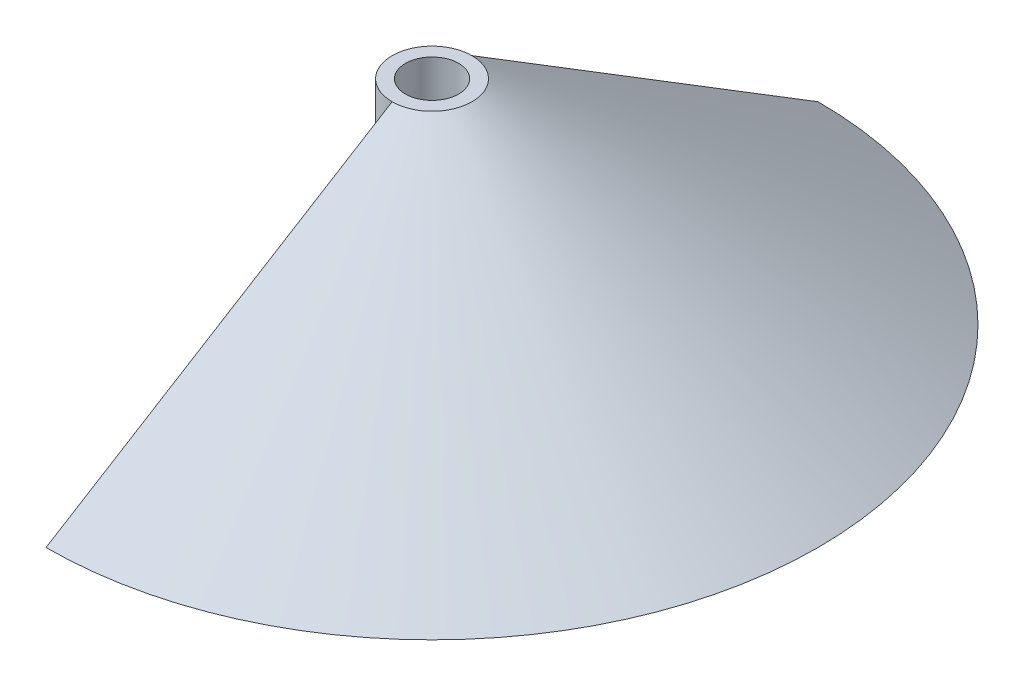
ISO-10303-21;
HEADER;
FILE_DESCRIPTION(('STEP AP214'),'2;1');
FILE_NAME('part.step','',(''),(''),'','','');
FILE_SCHEMA(('AUTOMOTIVE_DESIGN { 1 0 10303 214 1 1 1 1 }'));
ENDSEC;
DATA;
#1=APPLICATION_CONTEXT('core data for automotive mechanical design processes');
#2=APPLICATION_PROTOCOL_DEFINITION('international standard','automotive_design',2000,#1);
#3=PRODUCT_CONTEXT('',#1,'mechanical');
#4=PRODUCT('Part','Part','',(#3));
#5=PRODUCT_RELATED_PRODUCT_CATEGORY('part','',(#4));
#6=PRODUCT_DEFINITION_FORMATION('','',#4);
#7=PRODUCT_DEFINITION_CONTEXT('part definition',#1,'design');
#8=PRODUCT_DEFINITION('design','',#6,#7);
#9=PRODUCT_DEFINITION_SHAPE('','',#8);
#10=(LENGTH_UNIT() NAMED_UNIT(*) SI_UNIT(.MILLI.,.METRE.));
#11=(NAMED_UNIT(*) PLANE_ANGLE_UNIT() SI_UNIT($,.RADIAN.));
#12=(NAMED_UNIT(*) SI_UNIT($,.STERADIAN.) SOLID_ANGLE_UNIT());
#13=UNCERTAINTY_MEASURE_WITH_UNIT(LENGTH_MEASURE(1.E-05),#10,'distance_accuracy_value','');
#14=(GEOMETRIC_REPRESENTATION_CONTEXT(3) GLOBAL_UNCERTAINTY_ASSIGNED_CONTEXT((#13)) GLOBAL_UNIT_ASSIGNED_CONTEXT((#10,
#11,#12)) REPRESENTATION_CONTEXT('',''));
#15=CARTESIAN_POINT('',(0.,0.,0.));
#16=DIRECTION('',(0.,0.,1.));
#17=DIRECTION('',(1.,0.,0.));
#18=AXIS2_PLACEMENT_3D('',#15,#16,#17);
#19=CARTESIAN_POINT('',(0.,8.,0.));
#20=DIRECTION('',(0.,1.,0.));
#21=DIRECTION('',(0.,0.,1.));
#22=AXIS2_PLACEMENT_3D('',#19,#20,#21);
#23=PLANE('',#22);
#24=CARTESIAN_POINT('',(0.,8.,0.));
#25=DIRECTION('',(0.,1.,0.));
#26=DIRECTION('',(0.,0.,1.));
#27=AXIS2_PLACEMENT_3D('',#24,#25,#26);
#28=CIRCLE('',#27,2.);
#29=CARTESIAN_POINT('',(0.,8.,2.));
#30=VERTEX_POINT('',#29);
#31=EDGE_CURVE('E99',#30,#30,#28,.T.);
#32=ORIENTED_EDGE('',*,*,#31,.F.);
#33=EDGE_LOOP('',(#32));
#34=FACE_BOUND('',#33,.T.);
#35=CARTESIAN_POINT('',(0.,8.,0.));
#36=DIRECTION('',(0.,-1.,0.));
#37=DIRECTION('',(0.,0.,-1.));
#38=AXIS2_PLACEMENT_3D('',#35,#36,#37);
#39=CIRCLE('',#38,3.);
#40=CARTESIAN_POINT('',(0.,8.,-3.));
#41=VERTEX_POINT('',#40);
#42=CARTESIAN_POINT('',(0.,8.,3.));
#43=VERTEX_POINT('',#42);
#44=EDGE_CURVE('E105',#41,#43,#39,.T.);
#45=ORIENTED_EDGE('',*,*,#44,.F.);
#46=CARTESIAN_POINT('',(0.,8.,0.));
#47=DIRECTION('',(0.,-1.,0.));
#48=DIRECTION('',(0.,0.,1.));
#49=AXIS2_PLACEMENT_3D('',#46,#47,#48);
#50=CIRCLE('',#49,3.);
#51=EDGE_CURVE('E81',#43,#41,#50,.T.);
#52=ORIENTED_EDGE('',*,*,#51,.F.);
#53=EDGE_LOOP('',(#45,#52));
#54=FACE_BOUND('',#53,.T.);
#55=ADVANCED_FACE('F43',(#34,#54),#23,.T.);
#56=CARTESIAN_POINT('',(0.,-8.,-29.));
#57=DIRECTION('',(0.,-1.,0.));
#58=DIRECTION('',(0.,0.,-1.));
#59=AXIS2_PLACEMENT_3D('',#56,#57,#58);
#60=PLANE('',#59);
#61=CARTESIAN_POINT('',(0.,-8.00000000000001,0.));
#62=DIRECTION('',(0.,1.,0.));
#63=DIRECTION('',(0.,0.,1.));
#64=AXIS2_PLACEMENT_3D('',#61,#62,#63);
#65=CIRCLE('',#64,2.);
#66=CARTESIAN_POINT('',(0.,-8.00000000000001,2.));
#67=VERTEX_POINT('',#66);
#68=EDGE_CURVE('E96',#67,#67,#65,.T.);
#69=ORIENTED_EDGE('',*,*,#68,.T.);
#70=EDGE_LOOP('',(#69));
#71=FACE_BOUND('',#70,.T.);
#72=DIRECTION('',(0.,0.,-1.));
#73=VECTOR('',#72,1.);
#74=CARTESIAN_POINT('',(0.,-8.,3.));
#75=LINE('',#74,#73);
#76=CARTESIAN_POINT('',(0.,-8.,29.));
#77=VERTEX_POINT('',#76);
#78=CARTESIAN_POINT('',(0.,-8.,3.));
#79=VERTEX_POINT('',#78);
#80=EDGE_CURVE('E83',#77,#79,#75,.T.);
#81=ORIENTED_EDGE('',*,*,#80,.T.);
#82=CARTESIAN_POINT('',(0.,-8.,0.));
#83=DIRECTION('',(0.,-1.,0.));
#84=DIRECTION('',(0.,0.,1.));
#85=AXIS2_PLACEMENT_3D('',#82,#83,#84);
#86=CIRCLE('',#85,3.);
#87=CARTESIAN_POINT('',(0.,-8.,-3.));
#88=VERTEX_POINT('',#87);
#89=EDGE_CURVE('E78',#79,#88,#86,.T.);
#90=ORIENTED_EDGE('',*,*,#89,.T.);
#91=DIRECTION('',(0.,0.,-1.));
#92=VECTOR('',#91,1.);
#93=CARTESIAN_POINT('',(0.,-8.,-3.));
#94=LINE('',#93,#92);
#95=CARTESIAN_POINT('',(0.,-8.,-29.));
#96=VERTEX_POINT('',#95);
#97=EDGE_CURVE('E85',#88,#96,#94,.T.);
#98=ORIENTED_EDGE('',*,*,#97,.T.);
#99=CARTESIAN_POINT('',(0.,-8.,0.));
#100=DIRECTION('',(0.,-1.,0.));
#101=DIRECTION('',(0.,0.,-1.));
#102=AXIS2_PLACEMENT_3D('',#99,#100,#101);
#103=CIRCLE('',#102,29.);
#104=EDGE_CURVE('E110',#96,#77,#103,.T.);
#105=ORIENTED_EDGE('',*,*,#104,.T.);
#106=EDGE_LOOP('',(#81,#90,#98,#105));
#107=FACE_BOUND('',#106,.T.);
#108=ADVANCED_FACE('F92',(#71,#107),#60,.T.);
#109=CARTESIAN_POINT('',(0.,-8.,0.));
#110=DIRECTION('',(0.,-1.,0.));
#111=DIRECTION('',(0.,0.,-1.));
#112=AXIS2_PLACEMENT_3D('',#109,#110,#111);
#113=CONICAL_SURFACE('',#112,29.,1.01914134426635);
#114=DIRECTION('',(0.,-0.524097425664335,0.851658316704544));
#115=VECTOR('',#114,1.);
#116=CARTESIAN_POINT('',(0.,9.84615384615385,0.));
#117=LINE('',#116,#115);
#118=EDGE_CURVE('E11',#77,#43,#117,.F.);
#119=ORIENTED_EDGE('',*,*,#118,.F.);
#120=ORIENTED_EDGE('',*,*,#104,.F.);
#121=DIRECTION('',(0.,0.524097425664335,0.851658316704544));
#122=VECTOR('',#121,1.);
#123=CARTESIAN_POINT('',(0.,9.84615384615385,0.));
#124=LINE('',#123,#122);
#125=EDGE_CURVE('E51',#41,#96,#124,.F.);
#126=ORIENTED_EDGE('',*,*,#125,.F.);
#127=ORIENTED_EDGE('',*,*,#44,.T.);
#128=EDGE_LOOP('',(#119,#120,#126,#127));
#129=FACE_BOUND('',#128,.T.);
#130=ADVANCED_FACE('F115',(#129),#113,.T.);
#131=CARTESIAN_POINT('',(0.,-8.,0.));
#132=DIRECTION('',(0.,1.,0.));
#133=DIRECTION('',(0.,0.,1.));
#134=AXIS2_PLACEMENT_3D('',#131,#132,#133);
#135=CYLINDRICAL_SURFACE('',#134,3.);
#136=ORIENTED_EDGE('',*,*,#51,.T.);
#137=DIRECTION('',(0.,1.,0.));
#138=VECTOR('',#137,1.);
#139=CARTESIAN_POINT('',(0.,-8.,-3.));
#140=LINE('',#139,#138);
#141=EDGE_CURVE('E75',#88,#41,#140,.T.);
#142=ORIENTED_EDGE('',*,*,#141,.F.);
#143=ORIENTED_EDGE('',*,*,#89,.F.);
#144=DIRECTION('',(0.,1.,0.));
#145=VECTOR('',#144,1.);
#146=CARTESIAN_POINT('',(0.,-8.,3.));
#147=LINE('',#146,#145);
#148=EDGE_CURVE('E58',#79,#43,#147,.T.);
#149=ORIENTED_EDGE('',*,*,#148,.T.);
#150=EDGE_LOOP('',(#136,#142,#143,#149));
#151=FACE_BOUND('',#150,.T.);
#152=ADVANCED_FACE('F76',(#151),#135,.T.);
#153=CARTESIAN_POINT('',(0.,-8.,3.));
#154=DIRECTION('',(1.,0.,0.));
#155=DIRECTION('',(0.,0.,-1.));
#156=AXIS2_PLACEMENT_3D('',#153,#154,#155);
#157=PLANE('',#156);
#158=ORIENTED_EDGE('',*,*,#118,.T.);
#159=ORIENTED_EDGE('',*,*,#148,.F.);
#160=ORIENTED_EDGE('',*,*,#80,.F.);
#161=EDGE_LOOP('',(#158,#159,#160));
#162=FACE_BOUND('',#161,.T.);
#163=ADVANCED_FACE('F118',(#162),#157,.F.);
#164=CARTESIAN_POINT('',(0.,-8.,-3.));
#165=DIRECTION('',(1.,0.,0.));
#166=DIRECTION('',(0.,0.,-1.));
#167=AXIS2_PLACEMENT_3D('',#164,#165,#166);
#168=PLANE('',#167);
#169=ORIENTED_EDGE('',*,*,#125,.T.);
#170=ORIENTED_EDGE('',*,*,#97,.F.);
#171=ORIENTED_EDGE('',*,*,#141,.T.);
#172=EDGE_LOOP('',(#169,#170,#171));
#173=FACE_BOUND('',#172,.T.);
#174=ADVANCED_FACE('F86',(#173),#168,.F.);
#175=CARTESIAN_POINT('',(0.,-8.00000000000001,0.));
#176=DIRECTION('',(0.,1.,0.));
#177=DIRECTION('',(0.,0.,1.));
#178=AXIS2_PLACEMENT_3D('',#175,#176,#177);
#179=CYLINDRICAL_SURFACE('',#178,2.);
#180=ORIENTED_EDGE('',*,*,#68,.F.);
#181=EDGE_LOOP('',(#180));
#182=FACE_BOUND('',#181,.T.);
#183=ORIENTED_EDGE('',*,*,#31,.T.);
#184=EDGE_LOOP('',(#183));
#185=FACE_BOUND('',#184,.T.);
#186=ADVANCED_FACE('F134',(#182,#185),#179,.F.);
#187=CLOSED_SHELL('',(#55,#108,#130,#152,#163,#174,#186));
#188=MANIFOLD_SOLID_BREP('B2',#187);
#189=ADVANCED_BREP_SHAPE_REPRESENTATION('',(#18,#188),#14);
#190=SHAPE_DEFINITION_REPRESENTATION(#9,#189);
ENDSEC;
END-ISO-10303-21;
